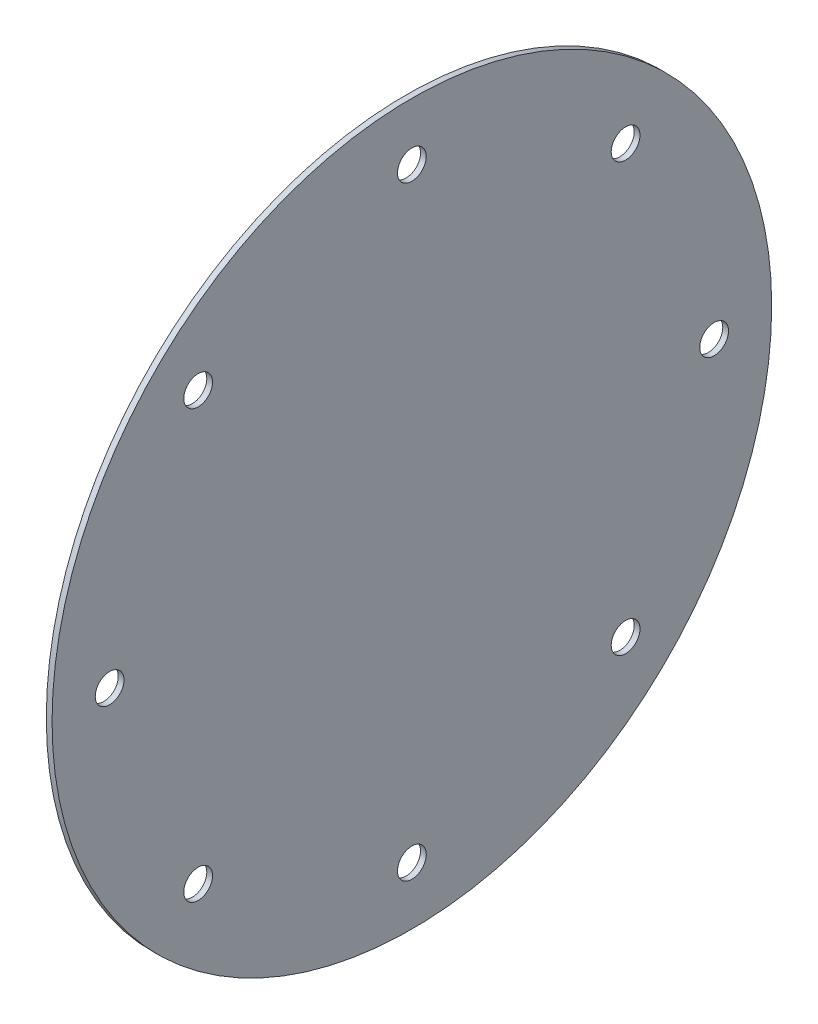
ISO-10303-21;
HEADER;
FILE_DESCRIPTION(('STEP AP214'),'2;1');
FILE_NAME('part.step','',(''),(''),'','','');
FILE_SCHEMA(('AUTOMOTIVE_DESIGN { 1 0 10303 214 1 1 1 1 }'));
ENDSEC;
DATA;
#1=APPLICATION_CONTEXT('core data for automotive mechanical design processes');
#2=APPLICATION_PROTOCOL_DEFINITION('international standard','automotive_design',2000,#1);
#3=PRODUCT_CONTEXT('',#1,'mechanical');
#4=PRODUCT('Part','Part','',(#3));
#5=PRODUCT_RELATED_PRODUCT_CATEGORY('part','',(#4));
#6=PRODUCT_DEFINITION_FORMATION('','',#4);
#7=PRODUCT_DEFINITION_CONTEXT('part definition',#1,'design');
#8=PRODUCT_DEFINITION('design','',#6,#7);
#9=PRODUCT_DEFINITION_SHAPE('','',#8);
#10=(LENGTH_UNIT() NAMED_UNIT(*) SI_UNIT(.MILLI.,.METRE.));
#11=(NAMED_UNIT(*) PLANE_ANGLE_UNIT() SI_UNIT($,.RADIAN.));
#12=(NAMED_UNIT(*) SI_UNIT($,.STERADIAN.) SOLID_ANGLE_UNIT());
#13=UNCERTAINTY_MEASURE_WITH_UNIT(LENGTH_MEASURE(1.E-05),#10,'distance_accuracy_value','');
#14=(GEOMETRIC_REPRESENTATION_CONTEXT(3) GLOBAL_UNCERTAINTY_ASSIGNED_CONTEXT((#13)) GLOBAL_UNIT_ASSIGNED_CONTEXT((#10,
#11,#12)) REPRESENTATION_CONTEXT('',''));
#15=CARTESIAN_POINT('',(0.,0.,0.));
#16=DIRECTION('',(0.,0.,1.));
#17=DIRECTION('',(1.,0.,0.));
#18=AXIS2_PLACEMENT_3D('',#15,#16,#17);
#19=CARTESIAN_POINT('',(370.,1280.,595.));
#20=DIRECTION('',(1.,0.,0.));
#21=DIRECTION('',(0.,0.,-1.));
#22=AXIS2_PLACEMENT_3D('',#19,#20,#21);
#23=CYLINDRICAL_SURFACE('',#22,125.);
#24=CARTESIAN_POINT('',(370.,1280.,595.));
#25=DIRECTION('',(-1.,0.,0.));
#26=DIRECTION('',(0.,0.,1.));
#27=AXIS2_PLACEMENT_3D('',#24,#25,#26);
#28=CIRCLE('',#27,125.);
#29=CARTESIAN_POINT('',(370.,1280.,720.));
#30=VERTEX_POINT('',#29);
#31=EDGE_CURVE('E10',#30,#30,#28,.T.);
#32=ORIENTED_EDGE('',*,*,#31,.F.);
#33=EDGE_LOOP('',(#32));
#34=FACE_BOUND('',#33,.T.);
#35=CARTESIAN_POINT('',(372.,1280.,595.));
#36=DIRECTION('',(-1.,0.,0.));
#37=DIRECTION('',(0.,0.,1.));
#38=AXIS2_PLACEMENT_3D('',#35,#36,#37);
#39=CIRCLE('',#38,125.);
#40=CARTESIAN_POINT('',(372.,1280.,720.));
#41=VERTEX_POINT('',#40);
#42=EDGE_CURVE('E22',#41,#41,#39,.T.);
#43=ORIENTED_EDGE('',*,*,#42,.T.);
#44=EDGE_LOOP('',(#43));
#45=FACE_BOUND('',#44,.T.);
#46=ADVANCED_FACE('F15',(#34,#45),#23,.T.);
#47=CARTESIAN_POINT('',(370.,1280.,595.));
#48=DIRECTION('',(-1.,0.,0.));
#49=DIRECTION('',(0.,-1.,0.));
#50=AXIS2_PLACEMENT_3D('',#47,#48,#49);
#51=PLANE('',#50);
#52=CARTESIAN_POINT('',(370.,1280.,700.));
#53=DIRECTION('',(1.,0.,0.));
#54=DIRECTION('',(0.,-1.,0.));
#55=AXIS2_PLACEMENT_3D('',#52,#53,#54);
#56=CIRCLE('',#55,5.);
#57=CARTESIAN_POINT('',(370.,1275.,700.));
#58=VERTEX_POINT('',#57);
#59=EDGE_CURVE('E65',#58,#58,#56,.T.);
#60=ORIENTED_EDGE('',*,*,#59,.T.);
#61=EDGE_LOOP('',(#60));
#62=FACE_BOUND('',#61,.T.);
#63=CARTESIAN_POINT('',(370.,1205.75378797541,669.246212024587));
#64=DIRECTION('',(1.,0.,0.));
#65=DIRECTION('',(0.,-0.707106781186548,-0.707106781186548));
#66=AXIS2_PLACEMENT_3D('',#63,#64,#65);
#67=CIRCLE('',#66,5.);
#68=CARTESIAN_POINT('',(370.,1202.21825406948,665.710678118654));
#69=VERTEX_POINT('',#68);
#70=EDGE_CURVE('E55',#69,#69,#67,.T.);
#71=ORIENTED_EDGE('',*,*,#70,.T.);
#72=EDGE_LOOP('',(#71));
#73=FACE_BOUND('',#72,.T.);
#74=CARTESIAN_POINT('',(370.,1175.,595.));
#75=DIRECTION('',(1.,0.,0.));
#76=DIRECTION('',(0.,0.,-1.));
#77=AXIS2_PLACEMENT_3D('',#74,#75,#76);
#78=CIRCLE('',#77,5.);
#79=CARTESIAN_POINT('',(370.,1175.,590.));
#80=VERTEX_POINT('',#79);
#81=EDGE_CURVE('E52',#80,#80,#78,.T.);
#82=ORIENTED_EDGE('',*,*,#81,.T.);
#83=EDGE_LOOP('',(#82));
#84=FACE_BOUND('',#83,.T.);
#85=CARTESIAN_POINT('',(370.,1205.75378797541,520.753787975413));
#86=DIRECTION('',(1.,0.,0.));
#87=DIRECTION('',(0.,0.707106781186548,-0.707106781186548));
#88=AXIS2_PLACEMENT_3D('',#85,#86,#87);
#89=CIRCLE('',#88,5.);
#90=CARTESIAN_POINT('',(370.,1209.28932188134,517.21825406948));
#91=VERTEX_POINT('',#90);
#92=EDGE_CURVE('E49',#91,#91,#89,.T.);
#93=ORIENTED_EDGE('',*,*,#92,.T.);
#94=EDGE_LOOP('',(#93));
#95=FACE_BOUND('',#94,.T.);
#96=CARTESIAN_POINT('',(370.,1280.,490.));
#97=DIRECTION('',(1.,0.,0.));
#98=DIRECTION('',(0.,1.,0.));
#99=AXIS2_PLACEMENT_3D('',#96,#97,#98);
#100=CIRCLE('',#99,5.);
#101=CARTESIAN_POINT('',(370.,1285.,490.));
#102=VERTEX_POINT('',#101);
#103=EDGE_CURVE('E45',#102,#102,#100,.T.);
#104=ORIENTED_EDGE('',*,*,#103,.T.);
#105=EDGE_LOOP('',(#104));
#106=FACE_BOUND('',#105,.T.);
#107=CARTESIAN_POINT('',(370.,1354.24621202459,520.753787975413));
#108=DIRECTION('',(1.,0.,0.));
#109=DIRECTION('',(0.,0.707106781186548,0.707106781186548));
#110=AXIS2_PLACEMENT_3D('',#107,#108,#109);
#111=CIRCLE('',#110,5.);
#112=CARTESIAN_POINT('',(370.,1357.78174593052,524.289321881346));
#113=VERTEX_POINT('',#112);
#114=EDGE_CURVE('E41',#113,#113,#111,.T.);
#115=ORIENTED_EDGE('',*,*,#114,.T.);
#116=EDGE_LOOP('',(#115));
#117=FACE_BOUND('',#116,.T.);
#118=CARTESIAN_POINT('',(370.,1385.,595.));
#119=DIRECTION('',(1.,0.,0.));
#120=DIRECTION('',(0.,0.,1.));
#121=AXIS2_PLACEMENT_3D('',#118,#119,#120);
#122=CIRCLE('',#121,5.);
#123=CARTESIAN_POINT('',(370.,1385.,600.));
#124=VERTEX_POINT('',#123);
#125=EDGE_CURVE('E37',#124,#124,#122,.T.);
#126=ORIENTED_EDGE('',*,*,#125,.T.);
#127=EDGE_LOOP('',(#126));
#128=FACE_BOUND('',#127,.T.);
#129=CARTESIAN_POINT('',(370.,1354.24621202459,669.246212024587));
#130=DIRECTION('',(1.,0.,0.));
#131=DIRECTION('',(0.,-0.707106781186548,0.707106781186548));
#132=AXIS2_PLACEMENT_3D('',#129,#130,#131);
#133=CIRCLE('',#132,5.);
#134=CARTESIAN_POINT('',(370.,1350.71067811865,672.78174593052));
#135=VERTEX_POINT('',#134);
#136=EDGE_CURVE('E33',#135,#135,#133,.T.);
#137=ORIENTED_EDGE('',*,*,#136,.T.);
#138=EDGE_LOOP('',(#137));
#139=FACE_BOUND('',#138,.T.);
#140=ORIENTED_EDGE('',*,*,#31,.T.);
#141=EDGE_LOOP('',(#140));
#142=FACE_BOUND('',#141,.T.);
#143=ADVANCED_FACE('F78',(#62,#73,#84,#95,#106,#117,#128,#139,#142),#51,.T.);
#144=CARTESIAN_POINT('',(372.,1280.,595.));
#145=DIRECTION('',(-1.,0.,0.));
#146=DIRECTION('',(0.,-1.,0.));
#147=AXIS2_PLACEMENT_3D('',#144,#145,#146);
#148=PLANE('',#147);
#149=CARTESIAN_POINT('',(372.,1280.,700.));
#150=DIRECTION('',(-1.,0.,0.));
#151=DIRECTION('',(0.,-1.,0.));
#152=AXIS2_PLACEMENT_3D('',#149,#150,#151);
#153=CIRCLE('',#152,5.);
#154=CARTESIAN_POINT('',(372.,1275.,700.));
#155=VERTEX_POINT('',#154);
#156=EDGE_CURVE('E18',#155,#155,#153,.T.);
#157=ORIENTED_EDGE('',*,*,#156,.T.);
#158=EDGE_LOOP('',(#157));
#159=FACE_BOUND('',#158,.T.);
#160=CARTESIAN_POINT('',(372.,1205.75378797541,669.246212024587));
#161=DIRECTION('',(-1.,0.,0.));
#162=DIRECTION('',(0.,-1.,0.));
#163=AXIS2_PLACEMENT_3D('',#160,#161,#162);
#164=CIRCLE('',#163,5.);
#165=CARTESIAN_POINT('',(372.,1200.75378797541,669.246212024587));
#166=VERTEX_POINT('',#165);
#167=EDGE_CURVE('E53',#166,#166,#164,.T.);
#168=ORIENTED_EDGE('',*,*,#167,.T.);
#169=EDGE_LOOP('',(#168));
#170=FACE_BOUND('',#169,.T.);
#171=CARTESIAN_POINT('',(372.,1175.,595.));
#172=DIRECTION('',(-1.,0.,0.));
#173=DIRECTION('',(0.,-1.,0.));
#174=AXIS2_PLACEMENT_3D('',#171,#172,#173);
#175=CIRCLE('',#174,5.);
#176=CARTESIAN_POINT('',(372.,1170.,595.));
#177=VERTEX_POINT('',#176);
#178=EDGE_CURVE('E50',#177,#177,#175,.T.);
#179=ORIENTED_EDGE('',*,*,#178,.T.);
#180=EDGE_LOOP('',(#179));
#181=FACE_BOUND('',#180,.T.);
#182=CARTESIAN_POINT('',(372.,1205.75378797541,520.753787975413));
#183=DIRECTION('',(-1.,0.,0.));
#184=DIRECTION('',(0.,-1.,0.));
#185=AXIS2_PLACEMENT_3D('',#182,#183,#184);
#186=CIRCLE('',#185,5.);
#187=CARTESIAN_POINT('',(372.,1200.75378797541,520.753787975413));
#188=VERTEX_POINT('',#187);
#189=EDGE_CURVE('E46',#188,#188,#186,.T.);
#190=ORIENTED_EDGE('',*,*,#189,.T.);
#191=EDGE_LOOP('',(#190));
#192=FACE_BOUND('',#191,.T.);
#193=CARTESIAN_POINT('',(372.,1280.,490.));
#194=DIRECTION('',(-1.,0.,0.));
#195=DIRECTION('',(0.,-1.,0.));
#196=AXIS2_PLACEMENT_3D('',#193,#194,#195);
#197=CIRCLE('',#196,5.);
#198=CARTESIAN_POINT('',(372.,1275.,490.));
#199=VERTEX_POINT('',#198);
#200=EDGE_CURVE('E42',#199,#199,#197,.T.);
#201=ORIENTED_EDGE('',*,*,#200,.T.);
#202=EDGE_LOOP('',(#201));
#203=FACE_BOUND('',#202,.T.);
#204=CARTESIAN_POINT('',(372.,1354.24621202459,520.753787975413));
#205=DIRECTION('',(-1.,0.,0.));
#206=DIRECTION('',(0.,-1.,0.));
#207=AXIS2_PLACEMENT_3D('',#204,#205,#206);
#208=CIRCLE('',#207,5.);
#209=CARTESIAN_POINT('',(372.,1349.24621202459,520.753787975413));
#210=VERTEX_POINT('',#209);
#211=EDGE_CURVE('E38',#210,#210,#208,.T.);
#212=ORIENTED_EDGE('',*,*,#211,.T.);
#213=EDGE_LOOP('',(#212));
#214=FACE_BOUND('',#213,.T.);
#215=CARTESIAN_POINT('',(372.,1385.,595.));
#216=DIRECTION('',(-1.,0.,0.));
#217=DIRECTION('',(0.,-1.,0.));
#218=AXIS2_PLACEMENT_3D('',#215,#216,#217);
#219=CIRCLE('',#218,5.);
#220=CARTESIAN_POINT('',(372.,1380.,595.));
#221=VERTEX_POINT('',#220);
#222=EDGE_CURVE('E34',#221,#221,#219,.T.);
#223=ORIENTED_EDGE('',*,*,#222,.T.);
#224=EDGE_LOOP('',(#223));
#225=FACE_BOUND('',#224,.T.);
#226=CARTESIAN_POINT('',(372.,1354.24621202459,669.246212024587));
#227=DIRECTION('',(-1.,0.,0.));
#228=DIRECTION('',(0.,-1.,0.));
#229=AXIS2_PLACEMENT_3D('',#226,#227,#228);
#230=CIRCLE('',#229,5.);
#231=CARTESIAN_POINT('',(372.,1349.24621202459,669.246212024587));
#232=VERTEX_POINT('',#231);
#233=EDGE_CURVE('E27',#232,#232,#230,.T.);
#234=ORIENTED_EDGE('',*,*,#233,.T.);
#235=EDGE_LOOP('',(#234));
#236=FACE_BOUND('',#235,.T.);
#237=ORIENTED_EDGE('',*,*,#42,.F.);
#238=EDGE_LOOP('',(#237));
#239=FACE_BOUND('',#238,.T.);
#240=ADVANCED_FACE('F84',(#159,#170,#181,#192,#203,#214,#225,#236,#239),#148,.F.);
#241=CARTESIAN_POINT('',(377.000000000181,1354.24621202459,669.246212024587));
#242=DIRECTION('',(-1.,0.,0.));
#243=DIRECTION('',(0.,-0.707106781186548,0.707106781186548));
#244=AXIS2_PLACEMENT_3D('',#241,#242,#243);
#245=CYLINDRICAL_SURFACE('',#244,5.);
#246=ORIENTED_EDGE('',*,*,#136,.F.);
#247=EDGE_LOOP('',(#246));
#248=FACE_BOUND('',#247,.T.);
#249=ORIENTED_EDGE('',*,*,#233,.F.);
#250=EDGE_LOOP('',(#249));
#251=FACE_BOUND('',#250,.T.);
#252=ADVANCED_FACE('F80',(#248,#251),#245,.F.);
#253=CARTESIAN_POINT('',(377.000000000181,1385.,595.));
#254=DIRECTION('',(-1.,0.,0.));
#255=DIRECTION('',(0.,0.,1.));
#256=AXIS2_PLACEMENT_3D('',#253,#254,#255);
#257=CYLINDRICAL_SURFACE('',#256,5.);
#258=ORIENTED_EDGE('',*,*,#125,.F.);
#259=EDGE_LOOP('',(#258));
#260=FACE_BOUND('',#259,.T.);
#261=ORIENTED_EDGE('',*,*,#222,.F.);
#262=EDGE_LOOP('',(#261));
#263=FACE_BOUND('',#262,.T.);
#264=ADVANCED_FACE('F83',(#260,#263),#257,.F.);
#265=CARTESIAN_POINT('',(377.000000000181,1354.24621202459,520.753787975413));
#266=DIRECTION('',(-1.,0.,0.));
#267=DIRECTION('',(0.,0.707106781186548,0.707106781186548));
#268=AXIS2_PLACEMENT_3D('',#265,#266,#267);
#269=CYLINDRICAL_SURFACE('',#268,5.);
#270=ORIENTED_EDGE('',*,*,#114,.F.);
#271=EDGE_LOOP('',(#270));
#272=FACE_BOUND('',#271,.T.);
#273=ORIENTED_EDGE('',*,*,#211,.F.);
#274=EDGE_LOOP('',(#273));
#275=FACE_BOUND('',#274,.T.);
#276=ADVANCED_FACE('F107',(#272,#275),#269,.F.);
#277=CARTESIAN_POINT('',(377.000000000181,1280.,490.));
#278=DIRECTION('',(-1.,0.,0.));
#279=DIRECTION('',(0.,1.,0.));
#280=AXIS2_PLACEMENT_3D('',#277,#278,#279);
#281=CYLINDRICAL_SURFACE('',#280,5.);
#282=ORIENTED_EDGE('',*,*,#103,.F.);
#283=EDGE_LOOP('',(#282));
#284=FACE_BOUND('',#283,.T.);
#285=ORIENTED_EDGE('',*,*,#200,.F.);
#286=EDGE_LOOP('',(#285));
#287=FACE_BOUND('',#286,.T.);
#288=ADVANCED_FACE('F111',(#284,#287),#281,.F.);
#289=CARTESIAN_POINT('',(377.000000000181,1205.75378797541,520.753787975413));
#290=DIRECTION('',(-1.,0.,0.));
#291=DIRECTION('',(0.,0.707106781186548,-0.707106781186548));
#292=AXIS2_PLACEMENT_3D('',#289,#290,#291);
#293=CYLINDRICAL_SURFACE('',#292,5.);
#294=ORIENTED_EDGE('',*,*,#92,.F.);
#295=EDGE_LOOP('',(#294));
#296=FACE_BOUND('',#295,.T.);
#297=ORIENTED_EDGE('',*,*,#189,.F.);
#298=EDGE_LOOP('',(#297));
#299=FACE_BOUND('',#298,.T.);
#300=ADVANCED_FACE('F115',(#296,#299),#293,.F.);
#301=CARTESIAN_POINT('',(377.000000000181,1175.,595.));
#302=DIRECTION('',(-1.,0.,0.));
#303=DIRECTION('',(0.,0.,-1.));
#304=AXIS2_PLACEMENT_3D('',#301,#302,#303);
#305=CYLINDRICAL_SURFACE('',#304,5.);
#306=ORIENTED_EDGE('',*,*,#81,.F.);
#307=EDGE_LOOP('',(#306));
#308=FACE_BOUND('',#307,.T.);
#309=ORIENTED_EDGE('',*,*,#178,.F.);
#310=EDGE_LOOP('',(#309));
#311=FACE_BOUND('',#310,.T.);
#312=ADVANCED_FACE('F119',(#308,#311),#305,.F.);
#313=CARTESIAN_POINT('',(377.000000000181,1205.75378797541,669.246212024587));
#314=DIRECTION('',(-1.,0.,0.));
#315=DIRECTION('',(0.,-0.707106781186548,-0.707106781186548));
#316=AXIS2_PLACEMENT_3D('',#313,#314,#315);
#317=CYLINDRICAL_SURFACE('',#316,5.);
#318=ORIENTED_EDGE('',*,*,#70,.F.);
#319=EDGE_LOOP('',(#318));
#320=FACE_BOUND('',#319,.T.);
#321=ORIENTED_EDGE('',*,*,#167,.F.);
#322=EDGE_LOOP('',(#321));
#323=FACE_BOUND('',#322,.T.);
#324=ADVANCED_FACE('F123',(#320,#323),#317,.F.);
#325=CARTESIAN_POINT('',(377.000000000181,1280.,700.));
#326=DIRECTION('',(-1.,0.,0.));
#327=DIRECTION('',(0.,-1.,0.));
#328=AXIS2_PLACEMENT_3D('',#325,#326,#327);
#329=CYLINDRICAL_SURFACE('',#328,5.);
#330=ORIENTED_EDGE('',*,*,#59,.F.);
#331=EDGE_LOOP('',(#330));
#332=FACE_BOUND('',#331,.T.);
#333=ORIENTED_EDGE('',*,*,#156,.F.);
#334=EDGE_LOOP('',(#333));
#335=FACE_BOUND('',#334,.T.);
#336=ADVANCED_FACE('F127',(#332,#335),#329,.F.);
#337=CLOSED_SHELL('',(#46,#143,#240,#252,#264,#276,#288,#300,#312,#324,#336));
#338=MANIFOLD_SOLID_BREP('B1',#337);
#339=ADVANCED_BREP_SHAPE_REPRESENTATION('',(#18,#338),#14);
#340=SHAPE_DEFINITION_REPRESENTATION(#9,#339);
ENDSEC;
END-ISO-10303-21;
